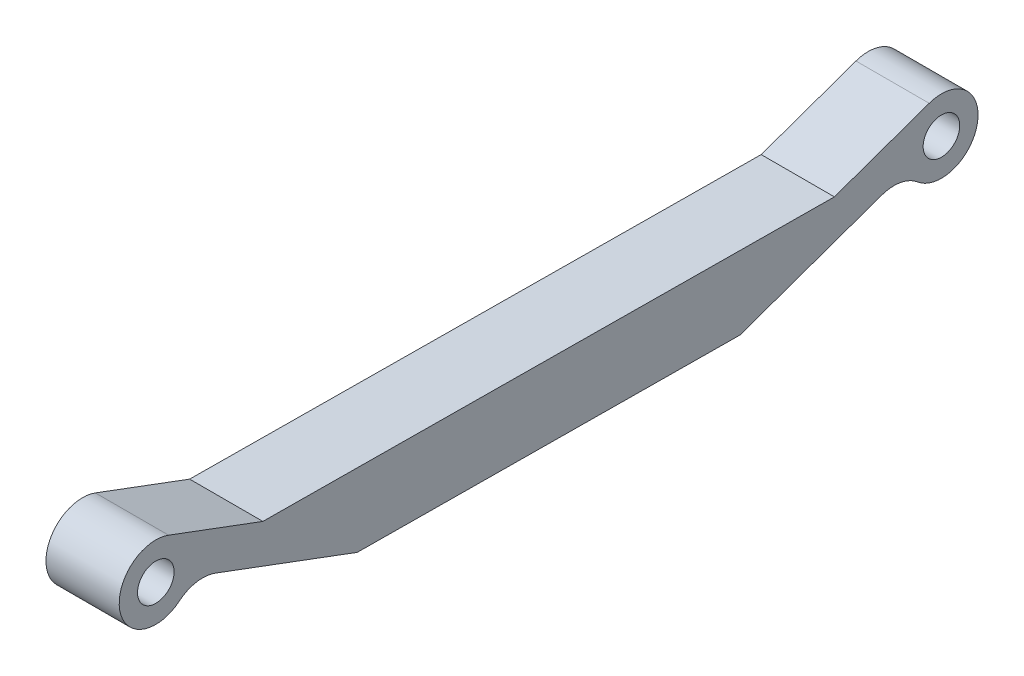
ISO-10303-21;
HEADER;
FILE_DESCRIPTION(('STEP AP214'),'2;1');
FILE_NAME('part.step','',(''),(''),'','','');
FILE_SCHEMA(('AUTOMOTIVE_DESIGN { 1 0 10303 214 1 1 1 1 }'));
ENDSEC;
DATA;
#1=APPLICATION_CONTEXT('core data for automotive mechanical design processes');
#2=APPLICATION_PROTOCOL_DEFINITION('international standard','automotive_design',2000,#1);
#3=PRODUCT_CONTEXT('',#1,'mechanical');
#4=PRODUCT('Part','Part','',(#3));
#5=PRODUCT_RELATED_PRODUCT_CATEGORY('part','',(#4));
#6=PRODUCT_DEFINITION_FORMATION('','',#4);
#7=PRODUCT_DEFINITION_CONTEXT('part definition',#1,'design');
#8=PRODUCT_DEFINITION('design','',#6,#7);
#9=PRODUCT_DEFINITION_SHAPE('','',#8);
#10=(LENGTH_UNIT() NAMED_UNIT(*) SI_UNIT(.MILLI.,.METRE.));
#11=(NAMED_UNIT(*) PLANE_ANGLE_UNIT() SI_UNIT($,.RADIAN.));
#12=(NAMED_UNIT(*) SI_UNIT($,.STERADIAN.) SOLID_ANGLE_UNIT());
#13=UNCERTAINTY_MEASURE_WITH_UNIT(LENGTH_MEASURE(1.E-05),#10,'distance_accuracy_value','');
#14=(GEOMETRIC_REPRESENTATION_CONTEXT(3) GLOBAL_UNCERTAINTY_ASSIGNED_CONTEXT((#13)) GLOBAL_UNIT_ASSIGNED_CONTEXT((#10,
#11,#12)) REPRESENTATION_CONTEXT('',''));
#15=CARTESIAN_POINT('',(0.,0.,0.));
#16=DIRECTION('',(0.,0.,1.));
#17=DIRECTION('',(1.,0.,0.));
#18=AXIS2_PLACEMENT_3D('',#15,#16,#17);
#19=CARTESIAN_POINT('',(-2.,-0.573778918138499,-37.4941331302027));
#20=DIRECTION('',(1.,0.,0.));
#21=DIRECTION('',(0.,0.,-1.));
#22=AXIS2_PLACEMENT_3D('',#19,#20,#21);
#23=CYLINDRICAL_SURFACE('',#22,2.);
#24=DIRECTION('',(1.,0.,0.));
#25=VECTOR('',#24,1.);
#26=CARTESIAN_POINT('',(-2.,0.950547408007201,-38.788903091014));
#27=LINE('',#26,#25);
#28=CARTESIAN_POINT('',(-2.,0.950547408007201,-38.788903091014));
#29=VERTEX_POINT('',#28);
#30=CARTESIAN_POINT('',(2.,0.950547408007201,-38.788903091014));
#31=VERTEX_POINT('',#30);
#32=EDGE_CURVE('E41',#29,#31,#27,.T.);
#33=ORIENTED_EDGE('',*,*,#32,.T.);
#34=CARTESIAN_POINT('',(2.,-0.573778918138499,-37.4941331302027));
#35=DIRECTION('',(1.,0.,0.));
#36=DIRECTION('',(0.,0.,-1.));
#37=AXIS2_PLACEMENT_3D('',#34,#35,#36);
#38=CIRCLE('',#37,2.);
#39=CARTESIAN_POINT('',(2.,1.31117816524492,-36.8255998148005));
#40=VERTEX_POINT('',#39);
#41=EDGE_CURVE('E118',#31,#40,#38,.T.);
#42=ORIENTED_EDGE('',*,*,#41,.T.);
#43=DIRECTION('',(1.,0.,0.));
#44=VECTOR('',#43,1.);
#45=CARTESIAN_POINT('',(-2.,1.31117816524492,-36.8255998148005));
#46=LINE('',#45,#44);
#47=CARTESIAN_POINT('',(-2.,1.31117816524492,-36.8255998148005));
#48=VERTEX_POINT('',#47);
#49=EDGE_CURVE('E11',#48,#40,#46,.T.);
#50=ORIENTED_EDGE('',*,*,#49,.F.);
#51=CARTESIAN_POINT('',(-2.,-0.573778918138499,-37.4941331302027));
#52=DIRECTION('',(1.,0.,0.));
#53=DIRECTION('',(0.,0.,-1.));
#54=AXIS2_PLACEMENT_3D('',#51,#52,#53);
#55=CIRCLE('',#54,2.);
#56=EDGE_CURVE('E54',#29,#48,#55,.T.);
#57=ORIENTED_EDGE('',*,*,#56,.F.);
#58=EDGE_LOOP('',(#33,#42,#50,#57));
#59=FACE_BOUND('',#58,.T.);
#60=ADVANCED_FACE('F38',(#59),#23,.F.);
#61=CARTESIAN_POINT('',(-2.,-10.436831016799,-3.70160642035904));
#62=DIRECTION('',(0.,-0.942478541691709,-0.334266657701108));
#63=DIRECTION('',(0.,0.334266657701108,-0.942478541691709));
#64=AXIS2_PLACEMENT_3D('',#61,#62,#63);
#65=PLANE('',#64);
#66=ORIENTED_EDGE('',*,*,#49,.T.);
#67=DIRECTION('',(0.,0.334266657701108,-0.942478541691709));
#68=VECTOR('',#67,1.);
#69=CARTESIAN_POINT('',(2.,-10.436831016799,-3.70160642035904));
#70=LINE('',#69,#68);
#71=CARTESIAN_POINT('',(2.,-1.43463287314901,-29.0836730518252));
#72=VERTEX_POINT('',#71);
#73=EDGE_CURVE('E136',#72,#40,#70,.T.);
#74=ORIENTED_EDGE('',*,*,#73,.F.);
#75=DIRECTION('',(1.,0.,0.));
#76=VECTOR('',#75,1.);
#77=CARTESIAN_POINT('',(-2.,-1.43463287314901,-29.0836730518252));
#78=LINE('',#77,#76);
#79=CARTESIAN_POINT('',(-2.,-1.43463287314901,-29.0836730518252));
#80=VERTEX_POINT('',#79);
#81=EDGE_CURVE('E46',#80,#72,#78,.T.);
#82=ORIENTED_EDGE('',*,*,#81,.F.);
#83=DIRECTION('',(0.,0.334266657701108,-0.942478541691709));
#84=VECTOR('',#83,1.);
#85=CARTESIAN_POINT('',(-2.,-10.436831016799,-3.70160642035904));
#86=LINE('',#85,#84);
#87=EDGE_CURVE('E185',#80,#48,#86,.T.);
#88=ORIENTED_EDGE('',*,*,#87,.T.);
#89=EDGE_LOOP('',(#66,#74,#82,#88));
#90=FACE_BOUND('',#89,.T.);
#91=ADVANCED_FACE('F234',(#90),#65,.T.);
#92=CARTESIAN_POINT('',(-2.,-1.19493097256869,0.00984505291370587));
#93=DIRECTION('',(0.,0.999966061052688,-0.00823873429425888));
#94=DIRECTION('',(0.,0.00823873429425888,0.999966061052688));
#95=AXIS2_PLACEMENT_3D('',#92,#93,#94);
#96=PLANE('',#95);
#97=ORIENTED_EDGE('',*,*,#81,.T.);
#98=DIRECTION('',(0.,0.00823873429425888,0.999966061052688));
#99=VECTOR('',#98,1.);
#100=CARTESIAN_POINT('',(2.,-1.19493097256869,0.00984505291370587));
#101=LINE('',#100,#99);
#102=CARTESIAN_POINT('',(2.,-1.26233778874553,-8.1715728752538));
#103=VERTEX_POINT('',#102);
#104=EDGE_CURVE('E155',#72,#103,#101,.T.);
#105=ORIENTED_EDGE('',*,*,#104,.T.);
#106=DIRECTION('',(1.,0.,0.));
#107=VECTOR('',#106,1.);
#108=CARTESIAN_POINT('',(-2.,-1.26233778874553,-8.1715728752538));
#109=LINE('',#108,#107);
#110=CARTESIAN_POINT('',(-2.,-1.26233778874553,-8.1715728752538));
#111=VERTEX_POINT('',#110);
#112=EDGE_CURVE('E193',#111,#103,#109,.T.);
#113=ORIENTED_EDGE('',*,*,#112,.F.);
#114=DIRECTION('',(0.,0.00823873429425888,0.999966061052688));
#115=VECTOR('',#114,1.);
#116=CARTESIAN_POINT('',(-2.,-1.19493097256869,0.00984505291370587));
#117=LINE('',#116,#115);
#118=EDGE_CURVE('E183',#80,#111,#117,.T.);
#119=ORIENTED_EDGE('',*,*,#118,.F.);
#120=EDGE_LOOP('',(#97,#105,#113,#119));
#121=FACE_BOUND('',#120,.T.);
#122=ADVANCED_FACE('F233',(#121),#96,.F.);
#123=CARTESIAN_POINT('',(-2.,1.56958547434556,-0.585971414559702));
#124=DIRECTION('',(0.,0.936842915523417,-0.349750413342976));
#125=DIRECTION('',(0.,0.349750413342976,0.936842915523417));
#126=AXIS2_PLACEMENT_3D('',#123,#124,#125);
#127=PLANE('',#126);
#128=ORIENTED_EDGE('',*,*,#112,.T.);
#129=DIRECTION('',(0.,0.349750413342976,0.936842915523417));
#130=VECTOR('',#129,1.);
#131=CARTESIAN_POINT('',(2.,1.56958547434556,-0.585971414559702));
#132=LINE('',#131,#130);
#133=CARTESIAN_POINT('',(2.,1.62778474722534,-0.430078599552314));
#134=VERTEX_POINT('',#133);
#135=EDGE_CURVE('E152',#103,#134,#132,.T.);
#136=ORIENTED_EDGE('',*,*,#135,.T.);
#137=DIRECTION('',(1.,0.,0.));
#138=VECTOR('',#137,1.);
#139=CARTESIAN_POINT('',(-2.,1.62778474722534,-0.430078599552314));
#140=LINE('',#139,#138);
#141=CARTESIAN_POINT('',(-2.,1.62778474722534,-0.430078599552314));
#142=VERTEX_POINT('',#141);
#143=EDGE_CURVE('E195',#142,#134,#140,.T.);
#144=ORIENTED_EDGE('',*,*,#143,.F.);
#145=DIRECTION('',(0.,0.349750413342976,0.936842915523417));
#146=VECTOR('',#145,1.);
#147=CARTESIAN_POINT('',(-2.,1.56958547434556,-0.585971414559702));
#148=LINE('',#147,#146);
#149=EDGE_CURVE('E181',#111,#142,#148,.T.);
#150=ORIENTED_EDGE('',*,*,#149,.F.);
#151=EDGE_LOOP('',(#128,#136,#144,#150));
#152=FACE_BOUND('',#151,.T.);
#153=ADVANCED_FACE('F230',(#152),#127,.F.);
#154=CARTESIAN_POINT('',(-2.,-0.245901083821493,0.269422227133638));
#155=DIRECTION('',(1.,0.,0.));
#156=DIRECTION('',(0.,0.,-1.));
#157=AXIS2_PLACEMENT_3D('',#154,#155,#156);
#158=CYLINDRICAL_SURFACE('',#157,2.);
#159=ORIENTED_EDGE('',*,*,#143,.T.);
#160=CARTESIAN_POINT('',(2.,-0.245901083821493,0.269422227133638));
#161=DIRECTION('',(1.,0.,0.));
#162=DIRECTION('',(0.,0.,-1.));
#163=AXIS2_PLACEMENT_3D('',#160,#161,#162);
#164=CIRCLE('',#163,2.);
#165=CARTESIAN_POINT('',(2.,1.29126302046235,1.54892467593992));
#166=VERTEX_POINT('',#165);
#167=EDGE_CURVE('E149',#134,#166,#164,.T.);
#168=ORIENTED_EDGE('',*,*,#167,.T.);
#169=DIRECTION('',(1.,0.,0.));
#170=VECTOR('',#169,1.);
#171=CARTESIAN_POINT('',(-2.,1.29126302046235,1.54892467593992));
#172=LINE('',#171,#170);
#173=CARTESIAN_POINT('',(-2.,1.29126302046235,1.54892467593992));
#174=VERTEX_POINT('',#173);
#175=EDGE_CURVE('E197',#174,#166,#172,.T.);
#176=ORIENTED_EDGE('',*,*,#175,.F.);
#177=CARTESIAN_POINT('',(-2.,-0.245901083821493,0.269422227133638));
#178=DIRECTION('',(1.,0.,0.));
#179=DIRECTION('',(0.,0.,-1.));
#180=AXIS2_PLACEMENT_3D('',#177,#178,#179);
#181=CIRCLE('',#180,2.);
#182=EDGE_CURVE('E179',#142,#174,#181,.T.);
#183=ORIENTED_EDGE('',*,*,#182,.F.);
#184=EDGE_LOOP('',(#159,#168,#176,#183));
#185=FACE_BOUND('',#184,.T.);
#186=ADVANCED_FACE('F226',(#185),#158,.F.);
#187=CARTESIAN_POINT('',(-2.,2.82842712474619,2.82842712474619));
#188=DIRECTION('',(1.,0.,0.));
#189=DIRECTION('',(0.,0.,-1.));
#190=AXIS2_PLACEMENT_3D('',#187,#188,#189);
#191=CYLINDRICAL_SURFACE('',#190,2.);
#192=ORIENTED_EDGE('',*,*,#175,.T.);
#193=CARTESIAN_POINT('',(2.,2.82842712474619,2.82842712474619));
#194=DIRECTION('',(1.,0.,0.));
#195=DIRECTION('',(0.,0.,-1.));
#196=AXIS2_PLACEMENT_3D('',#193,#194,#195);
#197=CIRCLE('',#196,2.);
#198=CARTESIAN_POINT('',(2.,4.70211295579302,2.12892629806024));
#199=VERTEX_POINT('',#198);
#200=EDGE_CURVE('E146',#199,#166,#197,.T.);
#201=ORIENTED_EDGE('',*,*,#200,.F.);
#202=DIRECTION('',(1.,0.,0.));
#203=VECTOR('',#202,1.);
#204=CARTESIAN_POINT('',(-2.,4.70211295579302,2.12892629806024));
#205=LINE('',#204,#203);
#206=CARTESIAN_POINT('',(-2.,4.70211295579302,2.12892629806024));
#207=VERTEX_POINT('',#206);
#208=EDGE_CURVE('E199',#207,#199,#205,.T.);
#209=ORIENTED_EDGE('',*,*,#208,.F.);
#210=CARTESIAN_POINT('',(-2.,2.82842712474619,2.82842712474619));
#211=DIRECTION('',(1.,0.,0.));
#212=DIRECTION('',(0.,0.,-1.));
#213=AXIS2_PLACEMENT_3D('',#210,#211,#212);
#214=CIRCLE('',#213,2.);
#215=EDGE_CURVE('E176',#207,#174,#214,.T.);
#216=ORIENTED_EDGE('',*,*,#215,.T.);
#217=EDGE_LOOP('',(#192,#201,#209,#216));
#218=FACE_BOUND('',#217,.T.);
#219=ADVANCED_FACE('F218',(#218),#191,.T.);
#220=CARTESIAN_POINT('',(-2.,3.42935879603162,-1.28027830123827));
#221=DIRECTION('',(0.,0.936842915523417,-0.349750413342976));
#222=DIRECTION('',(0.,0.349750413342977,0.936842915523418));
#223=AXIS2_PLACEMENT_3D('',#220,#221,#222);
#224=PLANE('',#223);
#225=ORIENTED_EDGE('',*,*,#208,.T.);
#226=DIRECTION('',(0.,0.349750413342977,0.936842915523418));
#227=VECTOR('',#226,1.);
#228=CARTESIAN_POINT('',(2.,3.42935879603162,-1.28027830123827));
#229=LINE('',#228,#227);
#230=CARTESIAN_POINT('',(2.,2.78025022958353,-3.01898321389299));
#231=VERTEX_POINT('',#230);
#232=EDGE_CURVE('E143',#231,#199,#229,.T.);
#233=ORIENTED_EDGE('',*,*,#232,.F.);
#234=DIRECTION('',(1.,0.,0.));
#235=VECTOR('',#234,1.);
#236=CARTESIAN_POINT('',(-2.,2.78025022958353,-3.01898321389299));
#237=LINE('',#236,#235);
#238=CARTESIAN_POINT('',(-2.,2.78025022958353,-3.01898321389299));
#239=VERTEX_POINT('',#238);
#240=EDGE_CURVE('E201',#239,#231,#237,.T.);
#241=ORIENTED_EDGE('',*,*,#240,.F.);
#242=DIRECTION('',(0.,0.349750413342977,0.936842915523418));
#243=VECTOR('',#242,1.);
#244=CARTESIAN_POINT('',(-2.,3.42935879603162,-1.28027830123827));
#245=LINE('',#244,#243);
#246=EDGE_CURVE('E173',#239,#207,#245,.T.);
#247=ORIENTED_EDGE('',*,*,#246,.T.);
#248=EDGE_LOOP('',(#225,#233,#241,#247));
#249=FACE_BOUND('',#248,.T.);
#250=ADVANCED_FACE('F214',(#249),#224,.T.);
#251=CARTESIAN_POINT('',(-2.,2.80493327164207,-0.0231098842633296));
#252=DIRECTION('',(0.,0.999966061052688,-0.00823873429425887));
#253=DIRECTION('',(0.,0.00823873429425887,0.999966061052688));
#254=AXIS2_PLACEMENT_3D('',#251,#252,#253);
#255=PLANE('',#254);
#256=ORIENTED_EDGE('',*,*,#240,.T.);
#257=DIRECTION('',(0.,0.00823873429425887,0.999966061052688));
#258=VECTOR('',#257,1.);
#259=CARTESIAN_POINT('',(2.,2.80493327164207,-0.0231098842633296));
#260=LINE('',#259,#258);
#261=CARTESIAN_POINT('',(2.,2.52305062931556,-34.2362627131859));
#262=VERTEX_POINT('',#261);
#263=EDGE_CURVE('E140',#262,#231,#260,.T.);
#264=ORIENTED_EDGE('',*,*,#263,.F.);
#265=DIRECTION('',(1.,0.,0.));
#266=VECTOR('',#265,1.);
#267=CARTESIAN_POINT('',(-2.,2.52305062931556,-34.2362627131859));
#268=LINE('',#267,#266);
#269=CARTESIAN_POINT('',(-2.,2.52305062931556,-34.2362627131859));
#270=VERTEX_POINT('',#269);
#271=EDGE_CURVE('E203',#270,#262,#268,.T.);
#272=ORIENTED_EDGE('',*,*,#271,.F.);
#273=DIRECTION('',(0.,0.00823873429425887,0.999966061052688));
#274=VECTOR('',#273,1.);
#275=CARTESIAN_POINT('',(-2.,2.80493327164207,-0.0231098842633296));
#276=LINE('',#275,#274);
#277=EDGE_CURVE('E170',#270,#239,#276,.T.);
#278=ORIENTED_EDGE('',*,*,#277,.T.);
#279=EDGE_LOOP('',(#256,#264,#272,#278));
#280=FACE_BOUND('',#279,.T.);
#281=ADVANCED_FACE('F210',(#280),#255,.T.);
#282=CARTESIAN_POINT('',(-2.,-8.54462358616744,-3.03050164127399));
#283=DIRECTION('',(0.,-0.942478541691709,-0.334266657701108));
#284=DIRECTION('',(0.,0.334266657701108,-0.942478541691709));
#285=AXIS2_PLACEMENT_3D('',#282,#283,#284);
#286=PLANE('',#285);
#287=ORIENTED_EDGE('',*,*,#271,.T.);
#288=DIRECTION('',(0.,0.334266657701108,-0.942478541691709));
#289=VECTOR('',#288,1.);
#290=CARTESIAN_POINT('',(2.,-8.54462358616744,-3.03050164127399));
#291=LINE('',#290,#289);
#292=CARTESIAN_POINT('',(2.,4.35983081753632,-39.415139736423));
#293=VERTEX_POINT('',#292);
#294=EDGE_CURVE('E130',#262,#293,#291,.T.);
#295=ORIENTED_EDGE('',*,*,#294,.T.);
#296=DIRECTION('',(1.,0.,0.));
#297=VECTOR('',#296,1.);
#298=CARTESIAN_POINT('',(-2.,4.35983081753632,-39.415139736423));
#299=LINE('',#298,#297);
#300=CARTESIAN_POINT('',(-2.,4.35983081753632,-39.415139736423));
#301=VERTEX_POINT('',#300);
#302=EDGE_CURVE('E121',#301,#293,#299,.T.);
#303=ORIENTED_EDGE('',*,*,#302,.F.);
#304=DIRECTION('',(0.,0.334266657701108,-0.942478541691709));
#305=VECTOR('',#304,1.);
#306=CARTESIAN_POINT('',(-2.,-8.54462358616744,-3.03050164127399));
#307=LINE('',#306,#305);
#308=EDGE_CURVE('E168',#270,#301,#307,.T.);
#309=ORIENTED_EDGE('',*,*,#308,.F.);
#310=EDGE_LOOP('',(#287,#295,#303,#309));
#311=FACE_BOUND('',#310,.T.);
#312=ADVANCED_FACE('F207',(#311),#286,.F.);
#313=CARTESIAN_POINT('',(-2.,2.82842712474619,2.82842712474619));
#314=DIRECTION('',(1.,0.,0.));
#315=DIRECTION('',(0.,0.,-1.));
#316=AXIS2_PLACEMENT_3D('',#313,#314,#315);
#317=CYLINDRICAL_SURFACE('',#316,1.);
#318=CARTESIAN_POINT('',(-2.,2.82842712474619,2.82842712474619));
#319=DIRECTION('',(1.,0.,0.));
#320=DIRECTION('',(0.,0.,-1.));
#321=AXIS2_PLACEMENT_3D('',#318,#319,#320);
#322=CIRCLE('',#321,1.);
#323=CARTESIAN_POINT('',(-2.,2.82842712474619,1.82842712474619));
#324=VERTEX_POINT('',#323);
#325=EDGE_CURVE('E187',#324,#324,#322,.T.);
#326=ORIENTED_EDGE('',*,*,#325,.F.);
#327=EDGE_LOOP('',(#326));
#328=FACE_BOUND('',#327,.T.);
#329=CARTESIAN_POINT('',(2.,2.82842712474619,2.82842712474619));
#330=DIRECTION('',(1.,0.,0.));
#331=DIRECTION('',(0.,0.,-1.));
#332=AXIS2_PLACEMENT_3D('',#329,#330,#331);
#333=CIRCLE('',#332,1.);
#334=CARTESIAN_POINT('',(2.,2.82842712474619,1.82842712474619));
#335=VERTEX_POINT('',#334);
#336=EDGE_CURVE('E159',#335,#335,#333,.T.);
#337=ORIENTED_EDGE('',*,*,#336,.T.);
#338=EDGE_LOOP('',(#337));
#339=FACE_BOUND('',#338,.T.);
#340=ADVANCED_FACE('F243',(#328,#339),#317,.F.);
#341=CARTESIAN_POINT('',(-2.,2.4748737341529,-40.0836730518252));
#342=DIRECTION('',(1.,0.,0.));
#343=DIRECTION('',(0.,0.,-1.));
#344=AXIS2_PLACEMENT_3D('',#341,#342,#343);
#345=CYLINDRICAL_SURFACE('',#344,2.);
#346=ORIENTED_EDGE('',*,*,#302,.T.);
#347=CARTESIAN_POINT('',(2.,2.4748737341529,-40.0836730518252));
#348=DIRECTION('',(1.,0.,0.));
#349=DIRECTION('',(0.,0.,-1.));
#350=AXIS2_PLACEMENT_3D('',#347,#348,#349);
#351=CIRCLE('',#350,2.);
#352=EDGE_CURVE('E124',#31,#293,#351,.T.);
#353=ORIENTED_EDGE('',*,*,#352,.F.);
#354=ORIENTED_EDGE('',*,*,#32,.F.);
#355=CARTESIAN_POINT('',(-2.,2.4748737341529,-40.0836730518252));
#356=DIRECTION('',(1.,0.,0.));
#357=DIRECTION('',(0.,0.,-1.));
#358=AXIS2_PLACEMENT_3D('',#355,#356,#357);
#359=CIRCLE('',#358,2.);
#360=EDGE_CURVE('E166',#29,#301,#359,.T.);
#361=ORIENTED_EDGE('',*,*,#360,.T.);
#362=EDGE_LOOP('',(#346,#353,#354,#361));
#363=FACE_BOUND('',#362,.T.);
#364=ADVANCED_FACE('F125',(#363),#345,.T.);
#365=CARTESIAN_POINT('',(-2.,2.4748737341529,-40.0836730518252));
#366=DIRECTION('',(1.,0.,0.));
#367=DIRECTION('',(0.,0.,-1.));
#368=AXIS2_PLACEMENT_3D('',#365,#366,#367);
#369=CYLINDRICAL_SURFACE('',#368,0.999999999999998);
#370=CARTESIAN_POINT('',(-2.,2.4748737341529,-40.0836730518252));
#371=DIRECTION('',(1.,0.,0.));
#372=DIRECTION('',(0.,0.,-1.));
#373=AXIS2_PLACEMENT_3D('',#370,#371,#372);
#374=CIRCLE('',#373,0.999999999999998);
#375=CARTESIAN_POINT('',(-2.,2.4748737341529,-41.0836730518252));
#376=VERTEX_POINT('',#375);
#377=EDGE_CURVE('E122',#376,#376,#374,.T.);
#378=ORIENTED_EDGE('',*,*,#377,.F.);
#379=EDGE_LOOP('',(#378));
#380=FACE_BOUND('',#379,.T.);
#381=CARTESIAN_POINT('',(2.,2.4748737341529,-40.0836730518252));
#382=DIRECTION('',(1.,0.,0.));
#383=DIRECTION('',(0.,0.,-1.));
#384=AXIS2_PLACEMENT_3D('',#381,#382,#383);
#385=CIRCLE('',#384,0.999999999999998);
#386=CARTESIAN_POINT('',(2.,2.4748737341529,-41.0836730518252));
#387=VERTEX_POINT('',#386);
#388=EDGE_CURVE('E162',#387,#387,#385,.T.);
#389=ORIENTED_EDGE('',*,*,#388,.T.);
#390=EDGE_LOOP('',(#389));
#391=FACE_BOUND('',#390,.T.);
#392=ADVANCED_FACE('F258',(#380,#391),#369,.F.);
#393=CARTESIAN_POINT('',(-2.,0.,0.));
#394=DIRECTION('',(1.,0.,0.));
#395=DIRECTION('',(0.,0.,-1.));
#396=AXIS2_PLACEMENT_3D('',#393,#394,#395);
#397=PLANE('',#396);
#398=ORIENTED_EDGE('',*,*,#56,.T.);
#399=ORIENTED_EDGE('',*,*,#87,.F.);
#400=ORIENTED_EDGE('',*,*,#118,.T.);
#401=ORIENTED_EDGE('',*,*,#149,.T.);
#402=ORIENTED_EDGE('',*,*,#182,.T.);
#403=ORIENTED_EDGE('',*,*,#215,.F.);
#404=ORIENTED_EDGE('',*,*,#246,.F.);
#405=ORIENTED_EDGE('',*,*,#277,.F.);
#406=ORIENTED_EDGE('',*,*,#308,.T.);
#407=ORIENTED_EDGE('',*,*,#360,.F.);
#408=EDGE_LOOP('',(#398,#399,#400,#401,#402,#403,#404,#405,#406,#407));
#409=FACE_BOUND('',#408,.T.);
#410=ORIENTED_EDGE('',*,*,#325,.T.);
#411=EDGE_LOOP('',(#410));
#412=FACE_BOUND('',#411,.T.);
#413=ORIENTED_EDGE('',*,*,#377,.T.);
#414=EDGE_LOOP('',(#413));
#415=FACE_BOUND('',#414,.T.);
#416=ADVANCED_FACE('F219',(#409,#412,#415),#397,.F.);
#417=CARTESIAN_POINT('',(2.,0.,0.));
#418=DIRECTION('',(1.,0.,0.));
#419=DIRECTION('',(0.,0.,-1.));
#420=AXIS2_PLACEMENT_3D('',#417,#418,#419);
#421=PLANE('',#420);
#422=ORIENTED_EDGE('',*,*,#41,.F.);
#423=ORIENTED_EDGE('',*,*,#352,.T.);
#424=ORIENTED_EDGE('',*,*,#294,.F.);
#425=ORIENTED_EDGE('',*,*,#263,.T.);
#426=ORIENTED_EDGE('',*,*,#232,.T.);
#427=ORIENTED_EDGE('',*,*,#200,.T.);
#428=ORIENTED_EDGE('',*,*,#167,.F.);
#429=ORIENTED_EDGE('',*,*,#135,.F.);
#430=ORIENTED_EDGE('',*,*,#104,.F.);
#431=ORIENTED_EDGE('',*,*,#73,.T.);
#432=EDGE_LOOP('',(#422,#423,#424,#425,#426,#427,#428,#429,#430,#431));
#433=FACE_BOUND('',#432,.T.);
#434=ORIENTED_EDGE('',*,*,#336,.F.);
#435=EDGE_LOOP('',(#434));
#436=FACE_BOUND('',#435,.T.);
#437=ORIENTED_EDGE('',*,*,#388,.F.);
#438=EDGE_LOOP('',(#437));
#439=FACE_BOUND('',#438,.T.);
#440=ADVANCED_FACE('F133',(#433,#436,#439),#421,.T.);
#441=CLOSED_SHELL('',(#60,#91,#122,#153,#186,#219,#250,#281,#312,#340,#364,#392,#416,#440));
#442=MANIFOLD_SOLID_BREP('B2',#441);
#443=ADVANCED_BREP_SHAPE_REPRESENTATION('',(#18,#442),#14);
#444=SHAPE_DEFINITION_REPRESENTATION(#9,#443);
ENDSEC;
END-ISO-10303-21;
